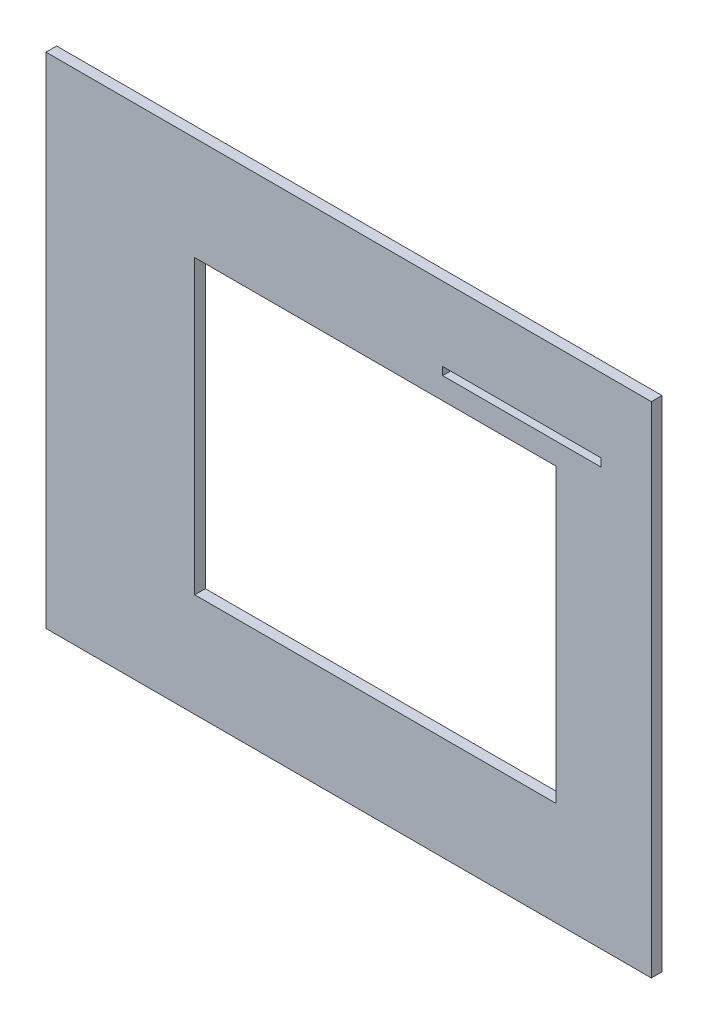
ISO-10303-21;
HEADER;
FILE_DESCRIPTION(('STEP AP214'),'2;1');
FILE_NAME('part.step','',(''),(''),'','','');
FILE_SCHEMA(('AUTOMOTIVE_DESIGN { 1 0 10303 214 1 1 1 1 }'));
ENDSEC;
DATA;
#1=APPLICATION_CONTEXT('core data for automotive mechanical design processes');
#2=APPLICATION_PROTOCOL_DEFINITION('international standard','automotive_design',2000,#1);
#3=PRODUCT_CONTEXT('',#1,'mechanical');
#4=PRODUCT('Part','Part','',(#3));
#5=PRODUCT_RELATED_PRODUCT_CATEGORY('part','',(#4));
#6=PRODUCT_DEFINITION_FORMATION('','',#4);
#7=PRODUCT_DEFINITION_CONTEXT('part definition',#1,'design');
#8=PRODUCT_DEFINITION('design','',#6,#7);
#9=PRODUCT_DEFINITION_SHAPE('','',#8);
#10=(LENGTH_UNIT() NAMED_UNIT(*) SI_UNIT(.MILLI.,.METRE.));
#11=(NAMED_UNIT(*) PLANE_ANGLE_UNIT() SI_UNIT($,.RADIAN.));
#12=(NAMED_UNIT(*) SI_UNIT($,.STERADIAN.) SOLID_ANGLE_UNIT());
#13=UNCERTAINTY_MEASURE_WITH_UNIT(LENGTH_MEASURE(1.E-05),#10,'distance_accuracy_value','');
#14=(GEOMETRIC_REPRESENTATION_CONTEXT(3) GLOBAL_UNCERTAINTY_ASSIGNED_CONTEXT((#13)) GLOBAL_UNIT_ASSIGNED_CONTEXT((#10,
#11,#12)) REPRESENTATION_CONTEXT('',''));
#15=CARTESIAN_POINT('',(0.,0.,0.));
#16=DIRECTION('',(0.,0.,1.));
#17=DIRECTION('',(1.,0.,0.));
#18=AXIS2_PLACEMENT_3D('',#15,#16,#17);
#19=CARTESIAN_POINT('',(0.,0.,0.));
#20=DIRECTION('',(0.,0.,1.));
#21=DIRECTION('',(1.,0.,0.));
#22=AXIS2_PLACEMENT_3D('',#19,#20,#21);
#23=PLANE('',#22);
#24=DIRECTION('',(0.,-1.,0.));
#25=VECTOR('',#24,1.);
#26=CARTESIAN_POINT('',(-27.9621826580409,59.6509992936084,0.));
#27=LINE('',#26,#25);
#28=CARTESIAN_POINT('',(-27.9621826580409,59.6509992936084,0.));
#29=VERTEX_POINT('',#28);
#30=CARTESIAN_POINT('',(-27.9621826580408,-34.3490007063916,0.));
#31=VERTEX_POINT('',#30);
#32=EDGE_CURVE('E328',#29,#31,#27,.T.);
#33=ORIENTED_EDGE('',*,*,#32,.F.);
#34=DIRECTION('',(-1.,0.,0.));
#35=VECTOR('',#34,1.);
#36=CARTESIAN_POINT('',(-27.9621826580409,59.6509992936084,0.));
#37=LINE('',#36,#35);
#38=CARTESIAN_POINT('',(86.0378173419592,59.6509992936084,0.));
#39=VERTEX_POINT('',#38);
#40=EDGE_CURVE('E333',#39,#29,#37,.T.);
#41=ORIENTED_EDGE('',*,*,#40,.F.);
#42=DIRECTION('',(0.,1.,0.));
#43=VECTOR('',#42,1.);
#44=CARTESIAN_POINT('',(86.0378173419592,59.6509992936084,0.));
#45=LINE('',#44,#43);
#46=CARTESIAN_POINT('',(86.0378173419592,-34.3490007063916,0.));
#47=VERTEX_POINT('',#46);
#48=EDGE_CURVE('E344',#47,#39,#45,.T.);
#49=ORIENTED_EDGE('',*,*,#48,.F.);
#50=DIRECTION('',(1.,0.,0.));
#51=VECTOR('',#50,1.);
#52=CARTESIAN_POINT('',(-27.9621826580408,-34.3490007063916,0.));
#53=LINE('',#52,#51);
#54=EDGE_CURVE('E342',#31,#47,#53,.T.);
#55=ORIENTED_EDGE('',*,*,#54,.F.);
#56=EDGE_LOOP('',(#33,#41,#49,#55));
#57=FACE_BOUND('',#56,.T.);
#58=DIRECTION('',(0.,-1.,0.));
#59=VECTOR('',#58,1.);
#60=CARTESIAN_POINT('',(79.2878173419592,-25.3490007063916,0.));
#61=LINE('',#60,#59);
#62=CARTESIAN_POINT('',(79.2878173419592,51.1509992936084,0.));
#63=VERTEX_POINT('',#62);
#64=CARTESIAN_POINT('',(79.2878173419592,-25.8490007063916,0.));
#65=VERTEX_POINT('',#64);
#66=EDGE_CURVE('E213',#63,#65,#61,.T.);
#67=ORIENTED_EDGE('',*,*,#66,.F.);
#68=DIRECTION('',(1.,0.,0.));
#69=VECTOR('',#68,1.);
#70=CARTESIAN_POINT('',(-10.7121826580408,51.1509992936084,0.));
#71=LINE('',#70,#69);
#72=CARTESIAN_POINT('',(-11.2121826580408,51.1509992936084,0.));
#73=VERTEX_POINT('',#72);
#74=EDGE_CURVE('E241',#73,#63,#71,.T.);
#75=ORIENTED_EDGE('',*,*,#74,.F.);
#76=DIRECTION('',(0.,1.,0.));
#77=VECTOR('',#76,1.);
#78=CARTESIAN_POINT('',(-11.2121826580408,-25.3490007063916,0.));
#79=LINE('',#78,#77);
#80=CARTESIAN_POINT('',(-11.2121826580408,-25.8490007063916,0.));
#81=VERTEX_POINT('',#80);
#82=EDGE_CURVE('E79',#81,#73,#79,.T.);
#83=ORIENTED_EDGE('',*,*,#82,.F.);
#84=DIRECTION('',(-1.,0.,0.));
#85=VECTOR('',#84,1.);
#86=CARTESIAN_POINT('',(-10.7121826580408,-25.8490007063916,0.));
#87=LINE('',#86,#85);
#88=EDGE_CURVE('E74',#65,#81,#87,.T.);
#89=ORIENTED_EDGE('',*,*,#88,.F.);
#90=EDGE_LOOP('',(#67,#75,#83,#89));
#91=FACE_BOUND('',#90,.T.);
#92=ADVANCED_FACE('F59',(#57,#91),#23,.F.);
#93=CARTESIAN_POINT('',(0.,0.,2.));
#94=DIRECTION('',(0.,0.,1.));
#95=DIRECTION('',(1.,0.,0.));
#96=AXIS2_PLACEMENT_3D('',#93,#94,#95);
#97=PLANE('',#96);
#98=DIRECTION('',(-1.,0.,0.));
#99=VECTOR('',#98,1.);
#100=CARTESIAN_POINT('',(0.,45.7364242756242,2.));
#101=LINE('',#100,#99);
#102=CARTESIAN_POINT('',(76.5976333238534,45.7364242756242,2.));
#103=VERTEX_POINT('',#102);
#104=CARTESIAN_POINT('',(46.7226704788644,45.7364242756242,2.));
#105=VERTEX_POINT('',#104);
#106=EDGE_CURVE('E294',#103,#105,#101,.T.);
#107=ORIENTED_EDGE('',*,*,#106,.F.);
#108=DIRECTION('',(0.,-1.,0.));
#109=VECTOR('',#108,1.);
#110=CARTESIAN_POINT('',(76.5976333238534,0.,2.));
#111=LINE('',#110,#109);
#112=CARTESIAN_POINT('',(76.5976333238534,44.2364242756242,2.));
#113=VERTEX_POINT('',#112);
#114=EDGE_CURVE('E291',#103,#113,#111,.T.);
#115=ORIENTED_EDGE('',*,*,#114,.T.);
#116=DIRECTION('',(-1.,0.,0.));
#117=VECTOR('',#116,1.);
#118=CARTESIAN_POINT('',(0.,44.2364242756242,2.));
#119=LINE('',#118,#117);
#120=CARTESIAN_POINT('',(46.7226704788644,44.2364242756242,2.));
#121=VERTEX_POINT('',#120);
#122=EDGE_CURVE('E288',#113,#121,#119,.T.);
#123=ORIENTED_EDGE('',*,*,#122,.T.);
#124=DIRECTION('',(0.,1.,0.));
#125=VECTOR('',#124,1.);
#126=CARTESIAN_POINT('',(46.7226704788644,0.,2.));
#127=LINE('',#126,#125);
#128=EDGE_CURVE('E278',#121,#105,#127,.T.);
#129=ORIENTED_EDGE('',*,*,#128,.T.);
#130=EDGE_LOOP('',(#107,#115,#123,#129));
#131=FACE_BOUND('',#130,.T.);
#132=DIRECTION('',(0.,-1.,0.));
#133=VECTOR('',#132,1.);
#134=CARTESIAN_POINT('',(-27.9621826580409,59.6509992936084,2.));
#135=LINE('',#134,#133);
#136=CARTESIAN_POINT('',(-27.9621826580409,59.6509992936084,2.));
#137=VERTEX_POINT('',#136);
#138=CARTESIAN_POINT('',(-27.9621826580408,-34.3490007063916,2.));
#139=VERTEX_POINT('',#138);
#140=EDGE_CURVE('E329',#137,#139,#135,.T.);
#141=ORIENTED_EDGE('',*,*,#140,.T.);
#142=DIRECTION('',(1.,0.,0.));
#143=VECTOR('',#142,1.);
#144=CARTESIAN_POINT('',(-27.9621826580408,-34.3490007063916,2.));
#145=LINE('',#144,#143);
#146=CARTESIAN_POINT('',(86.0378173419592,-34.3490007063916,2.));
#147=VERTEX_POINT('',#146);
#148=EDGE_CURVE('E332',#139,#147,#145,.T.);
#149=ORIENTED_EDGE('',*,*,#148,.T.);
#150=DIRECTION('',(0.,1.,0.));
#151=VECTOR('',#150,1.);
#152=CARTESIAN_POINT('',(86.0378173419592,59.6509992936084,2.));
#153=LINE('',#152,#151);
#154=CARTESIAN_POINT('',(86.0378173419592,59.6509992936084,2.));
#155=VERTEX_POINT('',#154);
#156=EDGE_CURVE('E335',#147,#155,#153,.T.);
#157=ORIENTED_EDGE('',*,*,#156,.T.);
#158=DIRECTION('',(-1.,0.,0.));
#159=VECTOR('',#158,1.);
#160=CARTESIAN_POINT('',(-27.9621826580409,59.6509992936084,2.));
#161=LINE('',#160,#159);
#162=EDGE_CURVE('E337',#155,#137,#161,.T.);
#163=ORIENTED_EDGE('',*,*,#162,.T.);
#164=EDGE_LOOP('',(#141,#149,#157,#163));
#165=FACE_BOUND('',#164,.T.);
#166=DIRECTION('',(-1.,0.,0.));
#167=VECTOR('',#166,1.);
#168=CARTESIAN_POINT('',(0.037817341959144,40.1509992936084,2.));
#169=LINE('',#168,#167);
#170=CARTESIAN_POINT('',(68.0378173419592,40.1509992936084,2.));
#171=VERTEX_POINT('',#170);
#172=CARTESIAN_POINT('',(0.037817341959144,40.1509992936084,2.));
#173=VERTEX_POINT('',#172);
#174=EDGE_CURVE('E300',#171,#173,#169,.T.);
#175=ORIENTED_EDGE('',*,*,#174,.F.);
#176=DIRECTION('',(0.,1.,0.));
#177=VECTOR('',#176,1.);
#178=CARTESIAN_POINT('',(68.0378173419591,-14.8490007063916,2.));
#179=LINE('',#178,#177);
#180=CARTESIAN_POINT('',(68.0378173419591,-14.8490007063916,2.));
#181=VERTEX_POINT('',#180);
#182=EDGE_CURVE('E298',#181,#171,#179,.T.);
#183=ORIENTED_EDGE('',*,*,#182,.F.);
#184=DIRECTION('',(1.,0.,0.));
#185=VECTOR('',#184,1.);
#186=CARTESIAN_POINT('',(0.037817341959144,-14.8490007063916,2.));
#187=LINE('',#186,#185);
#188=CARTESIAN_POINT('',(0.037817341959144,-14.8490007063916,2.));
#189=VERTEX_POINT('',#188);
#190=EDGE_CURVE('E306',#189,#181,#187,.T.);
#191=ORIENTED_EDGE('',*,*,#190,.F.);
#192=DIRECTION('',(0.,-1.,0.));
#193=VECTOR('',#192,1.);
#194=CARTESIAN_POINT('',(0.037817341959144,-14.8490007063916,2.));
#195=LINE('',#194,#193);
#196=EDGE_CURVE('E303',#173,#189,#195,.T.);
#197=ORIENTED_EDGE('',*,*,#196,.F.);
#198=EDGE_LOOP('',(#175,#183,#191,#197));
#199=FACE_BOUND('',#198,.T.);
#200=ADVANCED_FACE('F370',(#131,#165,#199),#97,.T.);
#201=DIRECTION('',(1.,0.,0.));
#202=VECTOR('',#201,1.);
#203=CARTESIAN_POINT('',(-10.7121826580408,50.1509992936084,0.));
#204=LINE('',#203,#202);
#205=CARTESIAN_POINT('',(-10.2121826580408,50.1509992936084,0.));
#206=VERTEX_POINT('',#205);
#207=CARTESIAN_POINT('',(78.2878173419592,50.1509992936084,0.));
#208=VERTEX_POINT('',#207);
#209=EDGE_CURVE('E206',#206,#208,#204,.T.);
#210=ORIENTED_EDGE('',*,*,#209,.T.);
#211=DIRECTION('',(0.,-1.,0.));
#212=VECTOR('',#211,1.);
#213=CARTESIAN_POINT('',(78.2878173419592,-25.3490007063916,0.));
#214=LINE('',#213,#212);
#215=CARTESIAN_POINT('',(78.2878173419592,-24.8490007063916,0.));
#216=VERTEX_POINT('',#215);
#217=EDGE_CURVE('E225',#208,#216,#214,.T.);
#218=ORIENTED_EDGE('',*,*,#217,.T.);
#219=DIRECTION('',(-1.,0.,0.));
#220=VECTOR('',#219,1.);
#221=CARTESIAN_POINT('',(-10.7121826580408,-24.8490007063916,0.));
#222=LINE('',#221,#220);
#223=CARTESIAN_POINT('',(-10.2121826580408,-24.8490007063916,0.));
#224=VERTEX_POINT('',#223);
#225=EDGE_CURVE('E212',#216,#224,#222,.T.);
#226=ORIENTED_EDGE('',*,*,#225,.T.);
#227=DIRECTION('',(0.,1.,0.));
#228=VECTOR('',#227,1.);
#229=CARTESIAN_POINT('',(-10.2121826580408,-25.3490007063916,0.));
#230=LINE('',#229,#228);
#231=EDGE_CURVE('E228',#224,#206,#230,.T.);
#232=ORIENTED_EDGE('',*,*,#231,.T.);
#233=EDGE_LOOP('',(#210,#218,#226,#232));
#234=FACE_BOUND('',#233,.T.);
#235=DIRECTION('',(0.,-1.,0.));
#236=VECTOR('',#235,1.);
#237=CARTESIAN_POINT('',(76.5976333238534,45.7364242756242,0.));
#238=LINE('',#237,#236);
#239=CARTESIAN_POINT('',(76.5976333238534,45.7364242756242,0.));
#240=VERTEX_POINT('',#239);
#241=CARTESIAN_POINT('',(76.5976333238534,44.2364242756242,0.));
#242=VERTEX_POINT('',#241);
#243=EDGE_CURVE('E272',#240,#242,#238,.T.);
#244=ORIENTED_EDGE('',*,*,#243,.F.);
#245=DIRECTION('',(1.,0.,0.));
#246=VECTOR('',#245,1.);
#247=CARTESIAN_POINT('',(76.5976333238534,45.7364242756242,0.));
#248=LINE('',#247,#246);
#249=CARTESIAN_POINT('',(46.7226704788644,45.7364242756242,0.));
#250=VERTEX_POINT('',#249);
#251=EDGE_CURVE('E264',#240,#250,#248,.F.);
#252=ORIENTED_EDGE('',*,*,#251,.T.);
#253=DIRECTION('',(0.,1.,0.));
#254=VECTOR('',#253,1.);
#255=CARTESIAN_POINT('',(46.7226704788644,44.2364242756242,0.));
#256=LINE('',#255,#254);
#257=CARTESIAN_POINT('',(46.7226704788644,44.2364242756242,0.));
#258=VERTEX_POINT('',#257);
#259=EDGE_CURVE('E267',#258,#250,#256,.T.);
#260=ORIENTED_EDGE('',*,*,#259,.F.);
#261=DIRECTION('',(1.,0.,0.));
#262=VECTOR('',#261,1.);
#263=CARTESIAN_POINT('',(76.5976333238534,44.2364242756242,0.));
#264=LINE('',#263,#262);
#265=EDGE_CURVE('E269',#242,#258,#264,.F.);
#266=ORIENTED_EDGE('',*,*,#265,.F.);
#267=EDGE_LOOP('',(#244,#252,#260,#266));
#268=FACE_BOUND('',#267,.T.);
#269=DIRECTION('',(0.,1.,0.));
#270=VECTOR('',#269,1.);
#271=CARTESIAN_POINT('',(68.0378173419591,-14.8490007063916,0.));
#272=LINE('',#271,#270);
#273=CARTESIAN_POINT('',(68.0378173419591,-14.8490007063916,0.));
#274=VERTEX_POINT('',#273);
#275=CARTESIAN_POINT('',(68.0378173419592,40.1509992936084,0.));
#276=VERTEX_POINT('',#275);
#277=EDGE_CURVE('E297',#274,#276,#272,.T.);
#278=ORIENTED_EDGE('',*,*,#277,.T.);
#279=DIRECTION('',(-1.,0.,0.));
#280=VECTOR('',#279,1.);
#281=CARTESIAN_POINT('',(0.037817341959144,40.1509992936084,0.));
#282=LINE('',#281,#280);
#283=CARTESIAN_POINT('',(0.037817341959144,40.1509992936084,0.));
#284=VERTEX_POINT('',#283);
#285=EDGE_CURVE('E311',#276,#284,#282,.T.);
#286=ORIENTED_EDGE('',*,*,#285,.T.);
#287=DIRECTION('',(0.,-1.,0.));
#288=VECTOR('',#287,1.);
#289=CARTESIAN_POINT('',(0.037817341959144,-14.8490007063916,0.));
#290=LINE('',#289,#288);
#291=CARTESIAN_POINT('',(0.037817341959144,-14.8490007063916,0.));
#292=VERTEX_POINT('',#291);
#293=EDGE_CURVE('E314',#284,#292,#290,.T.);
#294=ORIENTED_EDGE('',*,*,#293,.T.);
#295=DIRECTION('',(1.,0.,0.));
#296=VECTOR('',#295,1.);
#297=CARTESIAN_POINT('',(0.037817341959144,-14.8490007063916,0.));
#298=LINE('',#297,#296);
#299=EDGE_CURVE('E301',#292,#274,#298,.T.);
#300=ORIENTED_EDGE('',*,*,#299,.T.);
#301=EDGE_LOOP('',(#278,#286,#294,#300));
#302=FACE_BOUND('',#301,.T.);
#303=ADVANCED_FACE('F379',(#234,#268,#302),#23,.F.);
#304=CARTESIAN_POINT('',(-27.9621826580409,59.6509992936084,2.));
#305=DIRECTION('',(1.,0.,0.));
#306=DIRECTION('',(0.,1.,0.));
#307=AXIS2_PLACEMENT_3D('',#304,#305,#306);
#308=PLANE('',#307);
#309=ORIENTED_EDGE('',*,*,#32,.T.);
#310=DIRECTION('',(0.,0.,-1.));
#311=VECTOR('',#310,1.);
#312=CARTESIAN_POINT('',(-27.9621826580408,-34.3490007063916,2.));
#313=LINE('',#312,#311);
#314=EDGE_CURVE('E12',#139,#31,#313,.T.);
#315=ORIENTED_EDGE('',*,*,#314,.F.);
#316=ORIENTED_EDGE('',*,*,#140,.F.);
#317=DIRECTION('',(0.,0.,-1.));
#318=VECTOR('',#317,1.);
#319=CARTESIAN_POINT('',(-27.9621826580409,59.6509992936084,2.));
#320=LINE('',#319,#318);
#321=EDGE_CURVE('E339',#137,#29,#320,.T.);
#322=ORIENTED_EDGE('',*,*,#321,.T.);
#323=EDGE_LOOP('',(#309,#315,#316,#322));
#324=FACE_BOUND('',#323,.T.);
#325=ADVANCED_FACE('F61',(#324),#308,.F.);
#326=CARTESIAN_POINT('',(-27.9621826580408,-34.3490007063916,2.));
#327=DIRECTION('',(0.,1.,0.));
#328=DIRECTION('',(0.,0.,1.));
#329=AXIS2_PLACEMENT_3D('',#326,#327,#328);
#330=PLANE('',#329);
#331=ORIENTED_EDGE('',*,*,#54,.T.);
#332=DIRECTION('',(0.,0.,-1.));
#333=VECTOR('',#332,1.);
#334=CARTESIAN_POINT('',(86.0378173419592,-34.3490007063916,2.));
#335=LINE('',#334,#333);
#336=EDGE_CURVE('E67',#147,#47,#335,.T.);
#337=ORIENTED_EDGE('',*,*,#336,.F.);
#338=ORIENTED_EDGE('',*,*,#148,.F.);
#339=ORIENTED_EDGE('',*,*,#314,.T.);
#340=EDGE_LOOP('',(#331,#337,#338,#339));
#341=FACE_BOUND('',#340,.T.);
#342=ADVANCED_FACE('F372',(#341),#330,.F.);
#343=CARTESIAN_POINT('',(86.0378173419592,59.6509992936084,2.));
#344=DIRECTION('',(-1.,0.,0.));
#345=DIRECTION('',(0.,-1.,0.));
#346=AXIS2_PLACEMENT_3D('',#343,#344,#345);
#347=PLANE('',#346);
#348=ORIENTED_EDGE('',*,*,#48,.T.);
#349=DIRECTION('',(0.,0.,-1.));
#350=VECTOR('',#349,1.);
#351=CARTESIAN_POINT('',(86.0378173419592,59.6509992936084,2.));
#352=LINE('',#351,#350);
#353=EDGE_CURVE('E349',#155,#39,#352,.T.);
#354=ORIENTED_EDGE('',*,*,#353,.F.);
#355=ORIENTED_EDGE('',*,*,#156,.F.);
#356=ORIENTED_EDGE('',*,*,#336,.T.);
#357=EDGE_LOOP('',(#348,#354,#355,#356));
#358=FACE_BOUND('',#357,.T.);
#359=ADVANCED_FACE('F356',(#358),#347,.F.);
#360=CARTESIAN_POINT('',(-27.9621826580409,59.6509992936084,2.));
#361=DIRECTION('',(0.,-1.,0.));
#362=DIRECTION('',(1.,0.,0.));
#363=AXIS2_PLACEMENT_3D('',#360,#361,#362);
#364=PLANE('',#363);
#365=ORIENTED_EDGE('',*,*,#40,.T.);
#366=ORIENTED_EDGE('',*,*,#321,.F.);
#367=ORIENTED_EDGE('',*,*,#162,.F.);
#368=ORIENTED_EDGE('',*,*,#353,.T.);
#369=EDGE_LOOP('',(#365,#366,#367,#368));
#370=FACE_BOUND('',#369,.T.);
#371=ADVANCED_FACE('F364',(#370),#364,.F.);
#372=CARTESIAN_POINT('',(68.0378173419591,-14.8490007063916,2.));
#373=DIRECTION('',(-1.,0.,0.));
#374=DIRECTION('',(0.,-1.,0.));
#375=AXIS2_PLACEMENT_3D('',#372,#373,#374);
#376=PLANE('',#375);
#377=ORIENTED_EDGE('',*,*,#277,.F.);
#378=DIRECTION('',(0.,0.,-1.));
#379=VECTOR('',#378,1.);
#380=CARTESIAN_POINT('',(68.0378173419591,-14.8490007063916,2.));
#381=LINE('',#380,#379);
#382=EDGE_CURVE('E308',#181,#274,#381,.T.);
#383=ORIENTED_EDGE('',*,*,#382,.F.);
#384=ORIENTED_EDGE('',*,*,#182,.T.);
#385=DIRECTION('',(0.,0.,-1.));
#386=VECTOR('',#385,1.);
#387=CARTESIAN_POINT('',(68.0378173419592,40.1509992936084,2.));
#388=LINE('',#387,#386);
#389=EDGE_CURVE('E325',#171,#276,#388,.T.);
#390=ORIENTED_EDGE('',*,*,#389,.T.);
#391=EDGE_LOOP('',(#377,#383,#384,#390));
#392=FACE_BOUND('',#391,.T.);
#393=ADVANCED_FACE('F400',(#392),#376,.T.);
#394=CARTESIAN_POINT('',(0.037817341959144,40.1509992936084,2.));
#395=DIRECTION('',(0.,-1.,0.));
#396=DIRECTION('',(0.,0.,-1.));
#397=AXIS2_PLACEMENT_3D('',#394,#395,#396);
#398=PLANE('',#397);
#399=ORIENTED_EDGE('',*,*,#285,.F.);
#400=ORIENTED_EDGE('',*,*,#389,.F.);
#401=ORIENTED_EDGE('',*,*,#174,.T.);
#402=DIRECTION('',(0.,0.,-1.));
#403=VECTOR('',#402,1.);
#404=CARTESIAN_POINT('',(0.037817341959144,40.1509992936084,2.));
#405=LINE('',#404,#403);
#406=EDGE_CURVE('E323',#173,#284,#405,.T.);
#407=ORIENTED_EDGE('',*,*,#406,.T.);
#408=EDGE_LOOP('',(#399,#400,#401,#407));
#409=FACE_BOUND('',#408,.T.);
#410=ADVANCED_FACE('F409',(#409),#398,.T.);
#411=CARTESIAN_POINT('',(0.037817341959144,-14.8490007063916,2.));
#412=DIRECTION('',(1.,0.,0.));
#413=DIRECTION('',(0.,0.,-1.));
#414=AXIS2_PLACEMENT_3D('',#411,#412,#413);
#415=PLANE('',#414);
#416=ORIENTED_EDGE('',*,*,#293,.F.);
#417=ORIENTED_EDGE('',*,*,#406,.F.);
#418=ORIENTED_EDGE('',*,*,#196,.T.);
#419=DIRECTION('',(0.,0.,-1.));
#420=VECTOR('',#419,1.);
#421=CARTESIAN_POINT('',(0.037817341959144,-14.8490007063916,2.));
#422=LINE('',#421,#420);
#423=EDGE_CURVE('E321',#189,#292,#422,.T.);
#424=ORIENTED_EDGE('',*,*,#423,.T.);
#425=EDGE_LOOP('',(#416,#417,#418,#424));
#426=FACE_BOUND('',#425,.T.);
#427=ADVANCED_FACE('F413',(#426),#415,.T.);
#428=CARTESIAN_POINT('',(0.037817341959144,-14.8490007063916,2.));
#429=DIRECTION('',(0.,1.,0.));
#430=DIRECTION('',(-1.,0.,0.));
#431=AXIS2_PLACEMENT_3D('',#428,#429,#430);
#432=PLANE('',#431);
#433=ORIENTED_EDGE('',*,*,#299,.F.);
#434=ORIENTED_EDGE('',*,*,#423,.F.);
#435=ORIENTED_EDGE('',*,*,#190,.T.);
#436=ORIENTED_EDGE('',*,*,#382,.T.);
#437=EDGE_LOOP('',(#433,#434,#435,#436));
#438=FACE_BOUND('',#437,.T.);
#439=ADVANCED_FACE('F404',(#438),#432,.T.);
#440=CARTESIAN_POINT('',(76.5976333238534,45.7364242756242,0.));
#441=DIRECTION('',(0.,1.,0.));
#442=DIRECTION('',(0.,0.,1.));
#443=AXIS2_PLACEMENT_3D('',#440,#441,#442);
#444=PLANE('',#443);
#445=ORIENTED_EDGE('',*,*,#106,.T.);
#446=DIRECTION('',(0.,0.,1.));
#447=VECTOR('',#446,1.);
#448=CARTESIAN_POINT('',(46.7226704788644,45.7364242756242,0.));
#449=LINE('',#448,#447);
#450=EDGE_CURVE('E274',#250,#105,#449,.T.);
#451=ORIENTED_EDGE('',*,*,#450,.F.);
#452=ORIENTED_EDGE('',*,*,#251,.F.);
#453=DIRECTION('',(0.,0.,1.));
#454=VECTOR('',#453,1.);
#455=CARTESIAN_POINT('',(76.5976333238534,45.7364242756242,0.));
#456=LINE('',#455,#454);
#457=EDGE_CURVE('E275',#240,#103,#456,.T.);
#458=ORIENTED_EDGE('',*,*,#457,.T.);
#459=EDGE_LOOP('',(#445,#451,#452,#458));
#460=FACE_BOUND('',#459,.T.);
#461=ADVANCED_FACE('F420',(#460),#444,.F.);
#462=CARTESIAN_POINT('',(76.5976333238534,45.7364242756242,0.));
#463=DIRECTION('',(-1.,0.,0.));
#464=DIRECTION('',(0.,0.,1.));
#465=AXIS2_PLACEMENT_3D('',#462,#463,#464);
#466=PLANE('',#465);
#467=ORIENTED_EDGE('',*,*,#457,.F.);
#468=ORIENTED_EDGE('',*,*,#243,.T.);
#469=DIRECTION('',(0.,0.,1.));
#470=VECTOR('',#469,1.);
#471=CARTESIAN_POINT('',(76.5976333238534,44.2364242756242,0.));
#472=LINE('',#471,#470);
#473=EDGE_CURVE('E279',#242,#113,#472,.T.);
#474=ORIENTED_EDGE('',*,*,#473,.T.);
#475=ORIENTED_EDGE('',*,*,#114,.F.);
#476=EDGE_LOOP('',(#467,#468,#474,#475));
#477=FACE_BOUND('',#476,.T.);
#478=ADVANCED_FACE('F468',(#477),#466,.T.);
#479=CARTESIAN_POINT('',(76.5976333238534,44.2364242756242,0.));
#480=DIRECTION('',(0.,1.,0.));
#481=DIRECTION('',(0.,0.,1.));
#482=AXIS2_PLACEMENT_3D('',#479,#480,#481);
#483=PLANE('',#482);
#484=ORIENTED_EDGE('',*,*,#473,.F.);
#485=ORIENTED_EDGE('',*,*,#265,.T.);
#486=DIRECTION('',(0.,0.,1.));
#487=VECTOR('',#486,1.);
#488=CARTESIAN_POINT('',(46.7226704788644,44.2364242756242,0.));
#489=LINE('',#488,#487);
#490=EDGE_CURVE('E282',#258,#121,#489,.T.);
#491=ORIENTED_EDGE('',*,*,#490,.T.);
#492=ORIENTED_EDGE('',*,*,#122,.F.);
#493=EDGE_LOOP('',(#484,#485,#491,#492));
#494=FACE_BOUND('',#493,.T.);
#495=ADVANCED_FACE('F477',(#494),#483,.T.);
#496=CARTESIAN_POINT('',(46.7226704788644,44.2364242756242,0.));
#497=DIRECTION('',(1.,0.,0.));
#498=DIRECTION('',(0.,0.,-1.));
#499=AXIS2_PLACEMENT_3D('',#496,#497,#498);
#500=PLANE('',#499);
#501=ORIENTED_EDGE('',*,*,#490,.F.);
#502=ORIENTED_EDGE('',*,*,#259,.T.);
#503=ORIENTED_EDGE('',*,*,#450,.T.);
#504=ORIENTED_EDGE('',*,*,#128,.F.);
#505=EDGE_LOOP('',(#501,#502,#503,#504));
#506=FACE_BOUND('',#505,.T.);
#507=ADVANCED_FACE('F487',(#506),#500,.T.);
#508=CARTESIAN_POINT('',(0.,0.,-2.));
#509=DIRECTION('',(0.,0.,-1.));
#510=DIRECTION('',(-1.,0.,0.));
#511=AXIS2_PLACEMENT_3D('',#508,#509,#510);
#512=PLANE('',#511);
#513=DIRECTION('',(0.,-1.,0.));
#514=VECTOR('',#513,1.);
#515=CARTESIAN_POINT('',(79.2878173419592,-25.3490007063916,-2.));
#516=LINE('',#515,#514);
#517=CARTESIAN_POINT('',(79.2878173419592,51.1509992936084,-2.));
#518=VERTEX_POINT('',#517);
#519=CARTESIAN_POINT('',(79.2878173419592,-25.8490007063916,-2.));
#520=VERTEX_POINT('',#519);
#521=EDGE_CURVE('E237',#518,#520,#516,.T.);
#522=ORIENTED_EDGE('',*,*,#521,.T.);
#523=DIRECTION('',(-1.,0.,0.));
#524=VECTOR('',#523,1.);
#525=CARTESIAN_POINT('',(-10.7121826580408,-25.8490007063916,-2.));
#526=LINE('',#525,#524);
#527=CARTESIAN_POINT('',(-11.2121826580408,-25.8490007063916,-2.));
#528=VERTEX_POINT('',#527);
#529=EDGE_CURVE('E240',#520,#528,#526,.T.);
#530=ORIENTED_EDGE('',*,*,#529,.T.);
#531=DIRECTION('',(0.,1.,0.));
#532=VECTOR('',#531,1.);
#533=CARTESIAN_POINT('',(-11.2121826580408,-25.3490007063916,-2.));
#534=LINE('',#533,#532);
#535=CARTESIAN_POINT('',(-11.2121826580408,51.1509992936084,-2.));
#536=VERTEX_POINT('',#535);
#537=EDGE_CURVE('E243',#528,#536,#534,.T.);
#538=ORIENTED_EDGE('',*,*,#537,.T.);
#539=DIRECTION('',(1.,0.,0.));
#540=VECTOR('',#539,1.);
#541=CARTESIAN_POINT('',(-10.7121826580408,51.1509992936084,-2.));
#542=LINE('',#541,#540);
#543=EDGE_CURVE('E245',#536,#518,#542,.T.);
#544=ORIENTED_EDGE('',*,*,#543,.T.);
#545=EDGE_LOOP('',(#522,#530,#538,#544));
#546=FACE_BOUND('',#545,.T.);
#547=DIRECTION('',(-1.,0.,0.));
#548=VECTOR('',#547,1.);
#549=CARTESIAN_POINT('',(-10.7121826580408,-24.8490007063916,-2.));
#550=LINE('',#549,#548);
#551=CARTESIAN_POINT('',(78.2878173419592,-24.8490007063916,-2.));
#552=VERTEX_POINT('',#551);
#553=CARTESIAN_POINT('',(-10.2121826580408,-24.8490007063916,-2.));
#554=VERTEX_POINT('',#553);
#555=EDGE_CURVE('E205',#552,#554,#550,.T.);
#556=ORIENTED_EDGE('',*,*,#555,.F.);
#557=DIRECTION('',(0.,-1.,0.));
#558=VECTOR('',#557,1.);
#559=CARTESIAN_POINT('',(78.2878173419592,-25.3490007063916,-2.));
#560=LINE('',#559,#558);
#561=CARTESIAN_POINT('',(78.2878173419592,50.1509992936084,-2.));
#562=VERTEX_POINT('',#561);
#563=EDGE_CURVE('E195',#562,#552,#560,.T.);
#564=ORIENTED_EDGE('',*,*,#563,.F.);
#565=DIRECTION('',(1.,0.,0.));
#566=VECTOR('',#565,1.);
#567=CARTESIAN_POINT('',(-10.7121826580408,50.1509992936084,-2.));
#568=LINE('',#567,#566);
#569=CARTESIAN_POINT('',(-10.2121826580408,50.1509992936084,-2.));
#570=VERTEX_POINT('',#569);
#571=EDGE_CURVE('E221',#570,#562,#568,.T.);
#572=ORIENTED_EDGE('',*,*,#571,.F.);
#573=DIRECTION('',(0.,1.,0.));
#574=VECTOR('',#573,1.);
#575=CARTESIAN_POINT('',(-10.2121826580408,-25.3490007063916,-2.));
#576=LINE('',#575,#574);
#577=EDGE_CURVE('E219',#554,#570,#576,.T.);
#578=ORIENTED_EDGE('',*,*,#577,.F.);
#579=EDGE_LOOP('',(#556,#564,#572,#578));
#580=FACE_BOUND('',#579,.T.);
#581=ADVANCED_FACE('F217',(#546,#580),#512,.T.);
#582=CARTESIAN_POINT('',(79.2878173419592,-25.3490007063916,-2.));
#583=DIRECTION('',(-1.,0.,0.));
#584=DIRECTION('',(0.,0.,1.));
#585=AXIS2_PLACEMENT_3D('',#582,#583,#584);
#586=PLANE('',#585);
#587=ORIENTED_EDGE('',*,*,#66,.T.);
#588=DIRECTION('',(0.,0.,1.));
#589=VECTOR('',#588,1.);
#590=CARTESIAN_POINT('',(79.2878173419592,-25.8490007063916,-2.));
#591=LINE('',#590,#589);
#592=EDGE_CURVE('E262',#520,#65,#591,.T.);
#593=ORIENTED_EDGE('',*,*,#592,.F.);
#594=ORIENTED_EDGE('',*,*,#521,.F.);
#595=DIRECTION('',(0.,0.,1.));
#596=VECTOR('',#595,1.);
#597=CARTESIAN_POINT('',(79.2878173419592,51.1509992936084,-2.));
#598=LINE('',#597,#596);
#599=EDGE_CURVE('E247',#518,#63,#598,.T.);
#600=ORIENTED_EDGE('',*,*,#599,.T.);
#601=EDGE_LOOP('',(#587,#593,#594,#600));
#602=FACE_BOUND('',#601,.T.);
#603=ADVANCED_FACE('F510',(#602),#586,.F.);
#604=CARTESIAN_POINT('',(-10.7121826580408,-25.8490007063916,-2.));
#605=DIRECTION('',(0.,1.,0.));
#606=DIRECTION('',(-1.,0.,0.));
#607=AXIS2_PLACEMENT_3D('',#604,#605,#606);
#608=PLANE('',#607);
#609=ORIENTED_EDGE('',*,*,#88,.T.);
#610=DIRECTION('',(0.,0.,1.));
#611=VECTOR('',#610,1.);
#612=CARTESIAN_POINT('',(-11.2121826580408,-25.8490007063916,-2.));
#613=LINE('',#612,#611);
#614=EDGE_CURVE('E259',#528,#81,#613,.T.);
#615=ORIENTED_EDGE('',*,*,#614,.F.);
#616=ORIENTED_EDGE('',*,*,#529,.F.);
#617=ORIENTED_EDGE('',*,*,#592,.T.);
#618=EDGE_LOOP('',(#609,#615,#616,#617));
#619=FACE_BOUND('',#618,.T.);
#620=ADVANCED_FACE('F519',(#619),#608,.F.);
#621=CARTESIAN_POINT('',(-11.2121826580408,-25.3490007063916,-2.));
#622=DIRECTION('',(1.,0.,0.));
#623=DIRECTION('',(0.,0.,-1.));
#624=AXIS2_PLACEMENT_3D('',#621,#622,#623);
#625=PLANE('',#624);
#626=ORIENTED_EDGE('',*,*,#82,.T.);
#627=DIRECTION('',(0.,0.,1.));
#628=VECTOR('',#627,1.);
#629=CARTESIAN_POINT('',(-11.2121826580408,51.1509992936084,-2.));
#630=LINE('',#629,#628);
#631=EDGE_CURVE('E256',#536,#73,#630,.T.);
#632=ORIENTED_EDGE('',*,*,#631,.F.);
#633=ORIENTED_EDGE('',*,*,#537,.F.);
#634=ORIENTED_EDGE('',*,*,#614,.T.);
#635=EDGE_LOOP('',(#626,#632,#633,#634));
#636=FACE_BOUND('',#635,.T.);
#637=ADVANCED_FACE('F528',(#636),#625,.F.);
#638=CARTESIAN_POINT('',(-10.7121826580408,51.1509992936084,-2.));
#639=DIRECTION('',(0.,-1.,0.));
#640=DIRECTION('',(1.,0.,0.));
#641=AXIS2_PLACEMENT_3D('',#638,#639,#640);
#642=PLANE('',#641);
#643=ORIENTED_EDGE('',*,*,#74,.T.);
#644=ORIENTED_EDGE('',*,*,#599,.F.);
#645=ORIENTED_EDGE('',*,*,#543,.F.);
#646=ORIENTED_EDGE('',*,*,#631,.T.);
#647=EDGE_LOOP('',(#643,#644,#645,#646));
#648=FACE_BOUND('',#647,.T.);
#649=ADVANCED_FACE('F537',(#648),#642,.F.);
#650=CARTESIAN_POINT('',(78.2878173419592,-25.3490007063916,-2.));
#651=DIRECTION('',(-1.,0.,0.));
#652=DIRECTION('',(0.,0.,1.));
#653=AXIS2_PLACEMENT_3D('',#650,#651,#652);
#654=PLANE('',#653);
#655=ORIENTED_EDGE('',*,*,#217,.F.);
#656=DIRECTION('',(0.,0.,1.));
#657=VECTOR('',#656,1.);
#658=CARTESIAN_POINT('',(78.2878173419592,50.1509992936084,-2.));
#659=LINE('',#658,#657);
#660=EDGE_CURVE('E201',#562,#208,#659,.T.);
#661=ORIENTED_EDGE('',*,*,#660,.F.);
#662=ORIENTED_EDGE('',*,*,#563,.T.);
#663=DIRECTION('',(0.,0.,1.));
#664=VECTOR('',#663,1.);
#665=CARTESIAN_POINT('',(78.2878173419592,-24.8490007063916,-2.));
#666=LINE('',#665,#664);
#667=EDGE_CURVE('E199',#552,#216,#666,.T.);
#668=ORIENTED_EDGE('',*,*,#667,.T.);
#669=EDGE_LOOP('',(#655,#661,#662,#668));
#670=FACE_BOUND('',#669,.T.);
#671=ADVANCED_FACE('F198',(#670),#654,.T.);
#672=CARTESIAN_POINT('',(-10.7121826580408,-24.8490007063916,-2.));
#673=DIRECTION('',(0.,1.,0.));
#674=DIRECTION('',(-1.,0.,0.));
#675=AXIS2_PLACEMENT_3D('',#672,#673,#674);
#676=PLANE('',#675);
#677=ORIENTED_EDGE('',*,*,#225,.F.);
#678=ORIENTED_EDGE('',*,*,#667,.F.);
#679=ORIENTED_EDGE('',*,*,#555,.T.);
#680=DIRECTION('',(0.,0.,1.));
#681=VECTOR('',#680,1.);
#682=CARTESIAN_POINT('',(-10.2121826580408,-24.8490007063916,-2.));
#683=LINE('',#682,#681);
#684=EDGE_CURVE('E214',#554,#224,#683,.T.);
#685=ORIENTED_EDGE('',*,*,#684,.T.);
#686=EDGE_LOOP('',(#677,#678,#679,#685));
#687=FACE_BOUND('',#686,.T.);
#688=ADVANCED_FACE('F209',(#687),#676,.T.);
#689=CARTESIAN_POINT('',(-10.2121826580408,-25.3490007063916,-2.));
#690=DIRECTION('',(1.,0.,0.));
#691=DIRECTION('',(0.,0.,-1.));
#692=AXIS2_PLACEMENT_3D('',#689,#690,#691);
#693=PLANE('',#692);
#694=ORIENTED_EDGE('',*,*,#231,.F.);
#695=ORIENTED_EDGE('',*,*,#684,.F.);
#696=ORIENTED_EDGE('',*,*,#577,.T.);
#697=DIRECTION('',(0.,0.,1.));
#698=VECTOR('',#697,1.);
#699=CARTESIAN_POINT('',(-10.2121826580408,50.1509992936084,-2.));
#700=LINE('',#699,#698);
#701=EDGE_CURVE('E234',#570,#206,#700,.T.);
#702=ORIENTED_EDGE('',*,*,#701,.T.);
#703=EDGE_LOOP('',(#694,#695,#696,#702));
#704=FACE_BOUND('',#703,.T.);
#705=ADVANCED_FACE('F561',(#704),#693,.T.);
#706=CARTESIAN_POINT('',(-10.7121826580408,50.1509992936084,-2.));
#707=DIRECTION('',(0.,-1.,0.));
#708=DIRECTION('',(1.,0.,0.));
#709=AXIS2_PLACEMENT_3D('',#706,#707,#708);
#710=PLANE('',#709);
#711=ORIENTED_EDGE('',*,*,#209,.F.);
#712=ORIENTED_EDGE('',*,*,#701,.F.);
#713=ORIENTED_EDGE('',*,*,#571,.T.);
#714=ORIENTED_EDGE('',*,*,#660,.T.);
#715=EDGE_LOOP('',(#711,#712,#713,#714));
#716=FACE_BOUND('',#715,.T.);
#717=ADVANCED_FACE('F569',(#716),#710,.T.);
#718=CLOSED_SHELL('',(#92,#200,#303,#325,#342,#359,#371,#393,#410,#427,#439,#461,#478,#495,#507,
#581,#603,#620,#637,#649,#671,#688,#705,#717));
#719=MANIFOLD_SOLID_BREP('B2',#718);
#720=ADVANCED_BREP_SHAPE_REPRESENTATION('',(#18,#719),#14);
#721=SHAPE_DEFINITION_REPRESENTATION(#9,#720);
ENDSEC;
END-ISO-10303-21;
